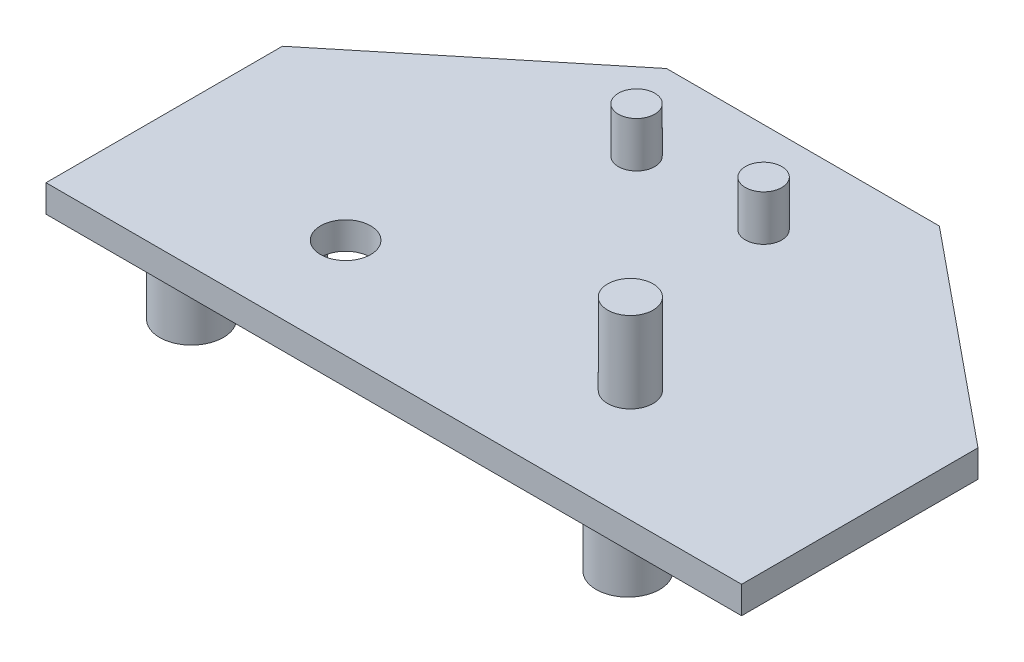
ISO-10303-21;
HEADER;
FILE_DESCRIPTION(('STEP AP214'),'2;1');
FILE_NAME('part.step','',(''),(''),'','','');
FILE_SCHEMA(('AUTOMOTIVE_DESIGN { 1 0 10303 214 1 1 1 1 }'));
ENDSEC;
DATA;
#1=APPLICATION_CONTEXT('core data for automotive mechanical design processes');
#2=APPLICATION_PROTOCOL_DEFINITION('international standard','automotive_design',2000,#1);
#3=PRODUCT_CONTEXT('',#1,'mechanical');
#4=PRODUCT('Part','Part','',(#3));
#5=PRODUCT_RELATED_PRODUCT_CATEGORY('part','',(#4));
#6=PRODUCT_DEFINITION_FORMATION('','',#4);
#7=PRODUCT_DEFINITION_CONTEXT('part definition',#1,'design');
#8=PRODUCT_DEFINITION('design','',#6,#7);
#9=PRODUCT_DEFINITION_SHAPE('','',#8);
#10=(LENGTH_UNIT() NAMED_UNIT(*) SI_UNIT(.MILLI.,.METRE.));
#11=(NAMED_UNIT(*) PLANE_ANGLE_UNIT() SI_UNIT($,.RADIAN.));
#12=(NAMED_UNIT(*) SI_UNIT($,.STERADIAN.) SOLID_ANGLE_UNIT());
#13=UNCERTAINTY_MEASURE_WITH_UNIT(LENGTH_MEASURE(1.E-05),#10,'distance_accuracy_value','');
#14=(GEOMETRIC_REPRESENTATION_CONTEXT(3) GLOBAL_UNCERTAINTY_ASSIGNED_CONTEXT((#13)) GLOBAL_UNIT_ASSIGNED_CONTEXT((#10,
#11,#12)) REPRESENTATION_CONTEXT('',''));
#15=CARTESIAN_POINT('',(0.,0.,0.));
#16=DIRECTION('',(0.,0.,1.));
#17=DIRECTION('',(1.,0.,0.));
#18=AXIS2_PLACEMENT_3D('',#15,#16,#17);
#19=CARTESIAN_POINT('',(0.,0.,0.));
#20=DIRECTION('',(0.,1.,0.));
#21=DIRECTION('',(0.,0.,1.));
#22=AXIS2_PLACEMENT_3D('',#19,#20,#21);
#23=PLANE('',#22);
#24=CARTESIAN_POINT('',(0.,0.,0.));
#25=DIRECTION('',(0.,1.,0.));
#26=DIRECTION('',(0.,0.,1.));
#27=AXIS2_PLACEMENT_3D('',#24,#25,#26);
#28=CIRCLE('',#27,3.5);
#29=CARTESIAN_POINT('',(0.,0.,3.5));
#30=VERTEX_POINT('',#29);
#31=EDGE_CURVE('E146',#30,#30,#28,.T.);
#32=ORIENTED_EDGE('',*,*,#31,.F.);
#33=EDGE_LOOP('',(#32));
#34=FACE_BOUND('',#33,.T.);
#35=CARTESIAN_POINT('',(0.,0.,0.));
#36=DIRECTION('',(0.,1.,0.));
#37=DIRECTION('',(0.,0.,1.));
#38=AXIS2_PLACEMENT_3D('',#35,#36,#37);
#39=CIRCLE('',#38,1.5);
#40=CARTESIAN_POINT('',(0.,0.,1.5));
#41=VERTEX_POINT('',#40);
#42=EDGE_CURVE('E143',#41,#41,#39,.T.);
#43=ORIENTED_EDGE('',*,*,#42,.T.);
#44=EDGE_LOOP('',(#43));
#45=FACE_BOUND('',#44,.T.);
#46=ADVANCED_FACE('F34',(#34,#45),#23,.F.);
#47=CARTESIAN_POINT('',(0.,10.,0.));
#48=DIRECTION('',(0.,-1.,0.));
#49=DIRECTION('',(0.,0.,-1.));
#50=AXIS2_PLACEMENT_3D('',#47,#48,#49);
#51=CYLINDRICAL_SURFACE('',#50,3.5);
#52=CARTESIAN_POINT('',(0.,10.,0.));
#53=DIRECTION('',(0.,1.,0.));
#54=DIRECTION('',(0.,0.,1.));
#55=AXIS2_PLACEMENT_3D('',#52,#53,#54);
#56=CIRCLE('',#55,3.5);
#57=CARTESIAN_POINT('',(0.,10.,3.5));
#58=VERTEX_POINT('',#57);
#59=EDGE_CURVE('E147',#58,#58,#56,.T.);
#60=ORIENTED_EDGE('',*,*,#59,.F.);
#61=EDGE_LOOP('',(#60));
#62=FACE_BOUND('',#61,.T.);
#63=ORIENTED_EDGE('',*,*,#31,.T.);
#64=EDGE_LOOP('',(#63));
#65=FACE_BOUND('',#64,.T.);
#66=ADVANCED_FACE('F36',(#62,#65),#51,.T.);
#67=CARTESIAN_POINT('',(0.,10.,0.));
#68=DIRECTION('',(0.,-1.,0.));
#69=DIRECTION('',(0.,0.,-1.));
#70=AXIS2_PLACEMENT_3D('',#67,#68,#69);
#71=CYLINDRICAL_SURFACE('',#70,1.5);
#72=CARTESIAN_POINT('',(0.,10.,0.));
#73=DIRECTION('',(0.,-1.,0.));
#74=DIRECTION('',(0.,0.,-1.));
#75=AXIS2_PLACEMENT_3D('',#72,#73,#74);
#76=CIRCLE('',#75,1.5);
#77=CARTESIAN_POINT('',(0.,10.,-1.5));
#78=VERTEX_POINT('',#77);
#79=EDGE_CURVE('E140',#78,#78,#76,.T.);
#80=ORIENTED_EDGE('',*,*,#79,.F.);
#81=EDGE_LOOP('',(#80));
#82=FACE_BOUND('',#81,.T.);
#83=ORIENTED_EDGE('',*,*,#42,.F.);
#84=EDGE_LOOP('',(#83));
#85=FACE_BOUND('',#84,.T.);
#86=ADVANCED_FACE('F236',(#82,#85),#71,.F.);
#87=CARTESIAN_POINT('',(0.,10.,0.));
#88=DIRECTION('',(0.,-1.,0.));
#89=DIRECTION('',(0.,0.,-1.));
#90=AXIS2_PLACEMENT_3D('',#87,#88,#89);
#91=PLANE('',#90);
#92=ORIENTED_EDGE('',*,*,#79,.T.);
#93=EDGE_LOOP('',(#92));
#94=FACE_BOUND('',#93,.T.);
#95=ADVANCED_FACE('F243',(#94),#91,.T.);
#96=CARTESIAN_POINT('',(68.5,13.,18.));
#97=DIRECTION('',(0.,0.,-1.));
#98=DIRECTION('',(-1.,0.,0.));
#99=AXIS2_PLACEMENT_3D('',#96,#97,#98);
#100=PLANE('',#99);
#101=DIRECTION('',(1.,0.,0.));
#102=VECTOR('',#101,1.);
#103=CARTESIAN_POINT('',(68.5,10.,18.));
#104=LINE('',#103,#102);
#105=CARTESIAN_POINT('',(-8.,10.,18.));
#106=VERTEX_POINT('',#105);
#107=CARTESIAN_POINT('',(68.5,10.,18.));
#108=VERTEX_POINT('',#107);
#109=EDGE_CURVE('E120',#106,#108,#104,.T.);
#110=ORIENTED_EDGE('',*,*,#109,.T.);
#111=DIRECTION('',(0.,-1.,0.));
#112=VECTOR('',#111,1.);
#113=CARTESIAN_POINT('',(68.5,13.,18.));
#114=LINE('',#113,#112);
#115=CARTESIAN_POINT('',(68.5,13.,18.));
#116=VERTEX_POINT('',#115);
#117=EDGE_CURVE('E138',#116,#108,#114,.T.);
#118=ORIENTED_EDGE('',*,*,#117,.F.);
#119=DIRECTION('',(1.,0.,0.));
#120=VECTOR('',#119,1.);
#121=CARTESIAN_POINT('',(68.5,13.,18.));
#122=LINE('',#121,#120);
#123=CARTESIAN_POINT('',(-8.,13.,18.));
#124=VERTEX_POINT('',#123);
#125=EDGE_CURVE('E131',#124,#116,#122,.T.);
#126=ORIENTED_EDGE('',*,*,#125,.F.);
#127=DIRECTION('',(0.,-1.,0.));
#128=VECTOR('',#127,1.);
#129=CARTESIAN_POINT('',(-8.,13.,18.));
#130=LINE('',#129,#128);
#131=EDGE_CURVE('E116',#124,#106,#130,.T.);
#132=ORIENTED_EDGE('',*,*,#131,.T.);
#133=EDGE_LOOP('',(#110,#118,#126,#132));
#134=FACE_BOUND('',#133,.T.);
#135=ADVANCED_FACE('F223',(#134),#100,.F.);
#136=CARTESIAN_POINT('',(68.5,13.,-8.));
#137=DIRECTION('',(-1.,0.,0.));
#138=DIRECTION('',(0.,0.,1.));
#139=AXIS2_PLACEMENT_3D('',#136,#137,#138);
#140=PLANE('',#139);
#141=DIRECTION('',(0.,0.,-1.));
#142=VECTOR('',#141,1.);
#143=CARTESIAN_POINT('',(68.5,10.,-8.));
#144=LINE('',#143,#142);
#145=CARTESIAN_POINT('',(68.5,10.,-8.));
#146=VERTEX_POINT('',#145);
#147=EDGE_CURVE('E123',#108,#146,#144,.T.);
#148=ORIENTED_EDGE('',*,*,#147,.T.);
#149=DIRECTION('',(0.,-1.,0.));
#150=VECTOR('',#149,1.);
#151=CARTESIAN_POINT('',(68.5,13.,-8.));
#152=LINE('',#151,#150);
#153=CARTESIAN_POINT('',(68.5,13.,-8.));
#154=VERTEX_POINT('',#153);
#155=EDGE_CURVE('E135',#154,#146,#152,.T.);
#156=ORIENTED_EDGE('',*,*,#155,.F.);
#157=DIRECTION('',(0.,0.,-1.));
#158=VECTOR('',#157,1.);
#159=CARTESIAN_POINT('',(68.5,13.,-8.));
#160=LINE('',#159,#158);
#161=EDGE_CURVE('E89',#116,#154,#160,.T.);
#162=ORIENTED_EDGE('',*,*,#161,.F.);
#163=ORIENTED_EDGE('',*,*,#117,.T.);
#164=EDGE_LOOP('',(#148,#156,#162,#163));
#165=FACE_BOUND('',#164,.T.);
#166=ADVANCED_FACE('F216',(#165),#140,.F.);
#167=CARTESIAN_POINT('',(45.25,13.,-27.));
#168=DIRECTION('',(-0.632784279625156,0.,0.774328131646573));
#169=DIRECTION('',(0.774328131646573,0.,0.632784279625156));
#170=AXIS2_PLACEMENT_3D('',#167,#168,#169);
#171=PLANE('',#170);
#172=DIRECTION('',(-0.774328131646573,0.,-0.632784279625156));
#173=VECTOR('',#172,1.);
#174=CARTESIAN_POINT('',(45.25,10.,-27.));
#175=LINE('',#174,#173);
#176=CARTESIAN_POINT('',(45.25,10.,-27.));
#177=VERTEX_POINT('',#176);
#178=EDGE_CURVE('E126',#146,#177,#175,.T.);
#179=ORIENTED_EDGE('',*,*,#178,.T.);
#180=DIRECTION('',(0.,-1.,0.));
#181=VECTOR('',#180,1.);
#182=CARTESIAN_POINT('',(45.25,13.,-27.));
#183=LINE('',#182,#181);
#184=CARTESIAN_POINT('',(45.25,13.,-27.));
#185=VERTEX_POINT('',#184);
#186=EDGE_CURVE('E111',#185,#177,#183,.T.);
#187=ORIENTED_EDGE('',*,*,#186,.F.);
#188=DIRECTION('',(-0.774328131646573,0.,-0.632784279625156));
#189=VECTOR('',#188,1.);
#190=CARTESIAN_POINT('',(45.25,13.,-27.));
#191=LINE('',#190,#189);
#192=EDGE_CURVE('E102',#154,#185,#191,.T.);
#193=ORIENTED_EDGE('',*,*,#192,.F.);
#194=ORIENTED_EDGE('',*,*,#155,.T.);
#195=EDGE_LOOP('',(#179,#187,#193,#194));
#196=FACE_BOUND('',#195,.T.);
#197=ADVANCED_FACE('F219',(#196),#171,.F.);
#198=CARTESIAN_POINT('',(15.25,13.,-27.));
#199=DIRECTION('',(0.,0.,1.));
#200=DIRECTION('',(1.,0.,0.));
#201=AXIS2_PLACEMENT_3D('',#198,#199,#200);
#202=PLANE('',#201);
#203=DIRECTION('',(-1.,0.,0.));
#204=VECTOR('',#203,1.);
#205=CARTESIAN_POINT('',(15.25,10.,-27.));
#206=LINE('',#205,#204);
#207=CARTESIAN_POINT('',(15.25,10.,-27.));
#208=VERTEX_POINT('',#207);
#209=EDGE_CURVE('E110',#177,#208,#206,.T.);
#210=ORIENTED_EDGE('',*,*,#209,.T.);
#211=DIRECTION('',(0.,-1.,0.));
#212=VECTOR('',#211,1.);
#213=CARTESIAN_POINT('',(15.25,13.,-27.));
#214=LINE('',#213,#212);
#215=CARTESIAN_POINT('',(15.25,13.,-27.));
#216=VERTEX_POINT('',#215);
#217=EDGE_CURVE('E107',#216,#208,#214,.T.);
#218=ORIENTED_EDGE('',*,*,#217,.F.);
#219=DIRECTION('',(-1.,0.,0.));
#220=VECTOR('',#219,1.);
#221=CARTESIAN_POINT('',(15.25,13.,-27.));
#222=LINE('',#221,#220);
#223=EDGE_CURVE('E96',#185,#216,#222,.T.);
#224=ORIENTED_EDGE('',*,*,#223,.F.);
#225=ORIENTED_EDGE('',*,*,#186,.T.);
#226=EDGE_LOOP('',(#210,#218,#224,#225));
#227=FACE_BOUND('',#226,.T.);
#228=ADVANCED_FACE('F108',(#227),#202,.F.);
#229=CARTESIAN_POINT('',(-8.,13.,-8.));
#230=DIRECTION('',(0.632784279625156,0.,0.774328131646573));
#231=DIRECTION('',(0.774328131646573,0.,-0.632784279625156));
#232=AXIS2_PLACEMENT_3D('',#229,#230,#231);
#233=PLANE('',#232);
#234=DIRECTION('',(-0.774328131646573,0.,0.632784279625156));
#235=VECTOR('',#234,1.);
#236=CARTESIAN_POINT('',(-8.,10.,-8.));
#237=LINE('',#236,#235);
#238=CARTESIAN_POINT('',(-8.,10.,-8.));
#239=VERTEX_POINT('',#238);
#240=EDGE_CURVE('E74',#208,#239,#237,.T.);
#241=ORIENTED_EDGE('',*,*,#240,.T.);
#242=DIRECTION('',(0.,-1.,0.));
#243=VECTOR('',#242,1.);
#244=CARTESIAN_POINT('',(-8.,13.,-8.));
#245=LINE('',#244,#243);
#246=CARTESIAN_POINT('',(-8.,13.,-8.));
#247=VERTEX_POINT('',#246);
#248=EDGE_CURVE('E112',#247,#239,#245,.T.);
#249=ORIENTED_EDGE('',*,*,#248,.F.);
#250=DIRECTION('',(-0.774328131646573,0.,0.632784279625156));
#251=VECTOR('',#250,1.);
#252=CARTESIAN_POINT('',(-8.,13.,-8.));
#253=LINE('',#252,#251);
#254=EDGE_CURVE('E100',#216,#247,#253,.T.);
#255=ORIENTED_EDGE('',*,*,#254,.F.);
#256=ORIENTED_EDGE('',*,*,#217,.T.);
#257=EDGE_LOOP('',(#241,#249,#255,#256));
#258=FACE_BOUND('',#257,.T.);
#259=ADVANCED_FACE('F114',(#258),#233,.F.);
#260=CARTESIAN_POINT('',(-8.,13.,18.));
#261=DIRECTION('',(1.,0.,0.));
#262=DIRECTION('',(0.,0.,-1.));
#263=AXIS2_PLACEMENT_3D('',#260,#261,#262);
#264=PLANE('',#263);
#265=DIRECTION('',(0.,0.,1.));
#266=VECTOR('',#265,1.);
#267=CARTESIAN_POINT('',(-8.,10.,18.));
#268=LINE('',#267,#266);
#269=EDGE_CURVE('E80',#239,#106,#268,.T.);
#270=ORIENTED_EDGE('',*,*,#269,.T.);
#271=ORIENTED_EDGE('',*,*,#131,.F.);
#272=DIRECTION('',(0.,0.,1.));
#273=VECTOR('',#272,1.);
#274=CARTESIAN_POINT('',(-8.,13.,18.));
#275=LINE('',#274,#273);
#276=EDGE_CURVE('E51',#247,#124,#275,.T.);
#277=ORIENTED_EDGE('',*,*,#276,.F.);
#278=ORIENTED_EDGE('',*,*,#248,.T.);
#279=EDGE_LOOP('',(#270,#271,#277,#278));
#280=FACE_BOUND('',#279,.T.);
#281=ADVANCED_FACE('F171',(#280),#264,.F.);
#282=CARTESIAN_POINT('',(0.,13.,0.));
#283=DIRECTION('',(0.,-1.,0.));
#284=DIRECTION('',(0.,0.,-1.));
#285=AXIS2_PLACEMENT_3D('',#282,#283,#284);
#286=PLANE('',#285);
#287=CARTESIAN_POINT('',(35.919609607067,13.,-17.));
#288=DIRECTION('',(0.,-1.,0.));
#289=DIRECTION('',(0.,0.,-1.));
#290=AXIS2_PLACEMENT_3D('',#287,#288,#289);
#291=CIRCLE('',#290,2.);
#292=CARTESIAN_POINT('',(35.919609607067,13.,-19.));
#293=VERTEX_POINT('',#292);
#294=EDGE_CURVE('E11',#293,#293,#291,.F.);
#295=ORIENTED_EDGE('',*,*,#294,.F.);
#296=EDGE_LOOP('',(#295));
#297=FACE_BOUND('',#296,.T.);
#298=CARTESIAN_POINT('',(21.95,13.,-17.));
#299=DIRECTION('',(0.,-1.,0.));
#300=DIRECTION('',(0.,0.,-1.));
#301=AXIS2_PLACEMENT_3D('',#298,#299,#300);
#302=CIRCLE('',#301,2.);
#303=CARTESIAN_POINT('',(21.95,13.,-19.));
#304=VERTEX_POINT('',#303);
#305=EDGE_CURVE('E43',#304,#304,#302,.F.);
#306=ORIENTED_EDGE('',*,*,#305,.F.);
#307=EDGE_LOOP('',(#306));
#308=FACE_BOUND('',#307,.T.);
#309=CARTESIAN_POINT('',(43.919609607067,13.,5.65));
#310=DIRECTION('',(0.,-1.,0.));
#311=DIRECTION('',(0.,0.,-1.));
#312=AXIS2_PLACEMENT_3D('',#309,#310,#311);
#313=CIRCLE('',#312,2.5);
#314=CARTESIAN_POINT('',(43.919609607067,13.,3.15));
#315=VERTEX_POINT('',#314);
#316=EDGE_CURVE('E161',#315,#315,#313,.F.);
#317=ORIENTED_EDGE('',*,*,#316,.F.);
#318=EDGE_LOOP('',(#317));
#319=FACE_BOUND('',#318,.T.);
#320=CARTESIAN_POINT('',(13.95,13.,7.));
#321=DIRECTION('',(0.,-1.,0.));
#322=DIRECTION('',(0.,0.,-1.));
#323=AXIS2_PLACEMENT_3D('',#320,#321,#322);
#324=CIRCLE('',#323,2.75);
#325=CARTESIAN_POINT('',(13.95,13.,4.25));
#326=VERTEX_POINT('',#325);
#327=EDGE_CURVE('E178',#326,#326,#324,.T.);
#328=ORIENTED_EDGE('',*,*,#327,.T.);
#329=EDGE_LOOP('',(#328));
#330=FACE_BOUND('',#329,.T.);
#331=ORIENTED_EDGE('',*,*,#125,.T.);
#332=ORIENTED_EDGE('',*,*,#161,.T.);
#333=ORIENTED_EDGE('',*,*,#192,.T.);
#334=ORIENTED_EDGE('',*,*,#223,.T.);
#335=ORIENTED_EDGE('',*,*,#254,.T.);
#336=ORIENTED_EDGE('',*,*,#276,.T.);
#337=EDGE_LOOP('',(#331,#332,#333,#334,#335,#336));
#338=FACE_BOUND('',#337,.T.);
#339=ADVANCED_FACE('F98',(#297,#308,#319,#330,#338),#286,.F.);
#340=CARTESIAN_POINT('',(13.95,10.,7.));
#341=DIRECTION('',(0.,-1.,0.));
#342=DIRECTION('',(0.,0.,-1.));
#343=AXIS2_PLACEMENT_3D('',#340,#341,#342);
#344=CIRCLE('',#343,2.75);
#345=CARTESIAN_POINT('',(13.95,10.,4.25));
#346=VERTEX_POINT('',#345);
#347=EDGE_CURVE('E181',#346,#346,#344,.T.);
#348=ORIENTED_EDGE('',*,*,#347,.F.);
#349=EDGE_LOOP('',(#348));
#350=FACE_BOUND('',#349,.T.);
#351=CARTESIAN_POINT('',(48.,10.,0.));
#352=DIRECTION('',(0.,1.,0.));
#353=DIRECTION('',(0.,0.,1.));
#354=AXIS2_PLACEMENT_3D('',#351,#352,#353);
#355=CIRCLE('',#354,3.5);
#356=CARTESIAN_POINT('',(48.,10.,3.5));
#357=VERTEX_POINT('',#356);
#358=EDGE_CURVE('E191',#357,#357,#355,.T.);
#359=ORIENTED_EDGE('',*,*,#358,.T.);
#360=EDGE_LOOP('',(#359));
#361=FACE_BOUND('',#360,.T.);
#362=CARTESIAN_POINT('',(48.,10.,10.));
#363=DIRECTION('',(0.,1.,0.));
#364=DIRECTION('',(0.,0.,1.));
#365=AXIS2_PLACEMENT_3D('',#362,#363,#364);
#366=CIRCLE('',#365,3.5);
#367=CARTESIAN_POINT('',(48.,10.,13.5));
#368=VERTEX_POINT('',#367);
#369=EDGE_CURVE('E200',#368,#368,#366,.T.);
#370=ORIENTED_EDGE('',*,*,#369,.T.);
#371=EDGE_LOOP('',(#370));
#372=FACE_BOUND('',#371,.T.);
#373=CARTESIAN_POINT('',(0.,10.,10.));
#374=DIRECTION('',(0.,1.,0.));
#375=DIRECTION('',(0.,0.,1.));
#376=AXIS2_PLACEMENT_3D('',#373,#374,#375);
#377=CIRCLE('',#376,3.5);
#378=CARTESIAN_POINT('',(0.,10.,13.5));
#379=VERTEX_POINT('',#378);
#380=EDGE_CURVE('E124',#379,#379,#377,.T.);
#381=ORIENTED_EDGE('',*,*,#380,.T.);
#382=EDGE_LOOP('',(#381));
#383=FACE_BOUND('',#382,.T.);
#384=ORIENTED_EDGE('',*,*,#59,.T.);
#385=EDGE_LOOP('',(#384));
#386=FACE_BOUND('',#385,.T.);
#387=ORIENTED_EDGE('',*,*,#109,.F.);
#388=ORIENTED_EDGE('',*,*,#269,.F.);
#389=ORIENTED_EDGE('',*,*,#240,.F.);
#390=ORIENTED_EDGE('',*,*,#209,.F.);
#391=ORIENTED_EDGE('',*,*,#178,.F.);
#392=ORIENTED_EDGE('',*,*,#147,.F.);
#393=EDGE_LOOP('',(#387,#388,#389,#390,#391,#392));
#394=FACE_BOUND('',#393,.T.);
#395=ADVANCED_FACE('F170',(#350,#361,#372,#383,#386,#394),#91,.T.);
#396=CARTESIAN_POINT('',(0.,0.,10.));
#397=DIRECTION('',(0.,1.,0.));
#398=DIRECTION('',(0.,0.,1.));
#399=AXIS2_PLACEMENT_3D('',#396,#397,#398);
#400=PLANE('',#399);
#401=CARTESIAN_POINT('',(0.,0.,10.));
#402=DIRECTION('',(0.,1.,0.));
#403=DIRECTION('',(0.,0.,1.));
#404=AXIS2_PLACEMENT_3D('',#401,#402,#403);
#405=CIRCLE('',#404,3.5);
#406=CARTESIAN_POINT('',(0.,0.,13.5));
#407=VERTEX_POINT('',#406);
#408=EDGE_CURVE('E208',#407,#407,#405,.T.);
#409=ORIENTED_EDGE('',*,*,#408,.F.);
#410=EDGE_LOOP('',(#409));
#411=FACE_BOUND('',#410,.T.);
#412=CARTESIAN_POINT('',(0.,0.,10.));
#413=DIRECTION('',(0.,1.,0.));
#414=DIRECTION('',(0.,0.,1.));
#415=AXIS2_PLACEMENT_3D('',#412,#413,#414);
#416=CIRCLE('',#415,1.5);
#417=CARTESIAN_POINT('',(0.,0.,11.5));
#418=VERTEX_POINT('',#417);
#419=EDGE_CURVE('E203',#418,#418,#416,.T.);
#420=ORIENTED_EDGE('',*,*,#419,.T.);
#421=EDGE_LOOP('',(#420));
#422=FACE_BOUND('',#421,.T.);
#423=ADVANCED_FACE('F270',(#411,#422),#400,.F.);
#424=CARTESIAN_POINT('',(0.,10.,10.));
#425=DIRECTION('',(0.,-1.,0.));
#426=DIRECTION('',(0.,0.,-1.));
#427=AXIS2_PLACEMENT_3D('',#424,#425,#426);
#428=CYLINDRICAL_SURFACE('',#427,3.5);
#429=ORIENTED_EDGE('',*,*,#380,.F.);
#430=EDGE_LOOP('',(#429));
#431=FACE_BOUND('',#430,.T.);
#432=ORIENTED_EDGE('',*,*,#408,.T.);
#433=EDGE_LOOP('',(#432));
#434=FACE_BOUND('',#433,.T.);
#435=ADVANCED_FACE('F275',(#431,#434),#428,.T.);
#436=CARTESIAN_POINT('',(0.,10.,10.));
#437=DIRECTION('',(0.,-1.,0.));
#438=DIRECTION('',(0.,0.,-1.));
#439=AXIS2_PLACEMENT_3D('',#436,#437,#438);
#440=CYLINDRICAL_SURFACE('',#439,1.5);
#441=CARTESIAN_POINT('',(0.,10.,10.));
#442=DIRECTION('',(0.,-1.,0.));
#443=DIRECTION('',(0.,0.,-1.));
#444=AXIS2_PLACEMENT_3D('',#441,#442,#443);
#445=CIRCLE('',#444,1.5);
#446=CARTESIAN_POINT('',(0.,10.,8.5));
#447=VERTEX_POINT('',#446);
#448=EDGE_CURVE('E150',#447,#447,#445,.F.);
#449=ORIENTED_EDGE('',*,*,#448,.T.);
#450=EDGE_LOOP('',(#449));
#451=FACE_BOUND('',#450,.T.);
#452=ORIENTED_EDGE('',*,*,#419,.F.);
#453=EDGE_LOOP('',(#452));
#454=FACE_BOUND('',#453,.T.);
#455=ADVANCED_FACE('F287',(#451,#454),#440,.F.);
#456=ORIENTED_EDGE('',*,*,#448,.F.);
#457=EDGE_LOOP('',(#456));
#458=FACE_BOUND('',#457,.T.);
#459=ADVANCED_FACE('F297',(#458),#91,.T.);
#460=CARTESIAN_POINT('',(48.,0.,10.));
#461=DIRECTION('',(0.,1.,0.));
#462=DIRECTION('',(0.,0.,1.));
#463=AXIS2_PLACEMENT_3D('',#460,#461,#462);
#464=PLANE('',#463);
#465=CARTESIAN_POINT('',(48.,0.,10.));
#466=DIRECTION('',(0.,1.,0.));
#467=DIRECTION('',(0.,0.,1.));
#468=AXIS2_PLACEMENT_3D('',#465,#466,#467);
#469=CIRCLE('',#468,3.5);
#470=CARTESIAN_POINT('',(48.,0.,13.5));
#471=VERTEX_POINT('',#470);
#472=EDGE_CURVE('E199',#471,#471,#469,.T.);
#473=ORIENTED_EDGE('',*,*,#472,.F.);
#474=EDGE_LOOP('',(#473));
#475=FACE_BOUND('',#474,.T.);
#476=CARTESIAN_POINT('',(48.,0.,10.));
#477=DIRECTION('',(0.,1.,0.));
#478=DIRECTION('',(0.,0.,1.));
#479=AXIS2_PLACEMENT_3D('',#476,#477,#478);
#480=CIRCLE('',#479,1.5);
#481=CARTESIAN_POINT('',(48.,0.,11.5));
#482=VERTEX_POINT('',#481);
#483=EDGE_CURVE('E194',#482,#482,#480,.T.);
#484=ORIENTED_EDGE('',*,*,#483,.T.);
#485=EDGE_LOOP('',(#484));
#486=FACE_BOUND('',#485,.T.);
#487=ADVANCED_FACE('F308',(#475,#486),#464,.F.);
#488=CARTESIAN_POINT('',(48.,10.,10.));
#489=DIRECTION('',(0.,-1.,0.));
#490=DIRECTION('',(0.,0.,-1.));
#491=AXIS2_PLACEMENT_3D('',#488,#489,#490);
#492=CYLINDRICAL_SURFACE('',#491,3.5);
#493=ORIENTED_EDGE('',*,*,#369,.F.);
#494=EDGE_LOOP('',(#493));
#495=FACE_BOUND('',#494,.T.);
#496=ORIENTED_EDGE('',*,*,#472,.T.);
#497=EDGE_LOOP('',(#496));
#498=FACE_BOUND('',#497,.T.);
#499=ADVANCED_FACE('F319',(#495,#498),#492,.T.);
#500=CARTESIAN_POINT('',(48.,10.,10.));
#501=DIRECTION('',(0.,-1.,0.));
#502=DIRECTION('',(0.,0.,-1.));
#503=AXIS2_PLACEMENT_3D('',#500,#501,#502);
#504=CYLINDRICAL_SURFACE('',#503,1.5);
#505=CARTESIAN_POINT('',(48.,10.,10.));
#506=DIRECTION('',(0.,-1.,0.));
#507=DIRECTION('',(0.,0.,-1.));
#508=AXIS2_PLACEMENT_3D('',#505,#506,#507);
#509=CIRCLE('',#508,1.5);
#510=CARTESIAN_POINT('',(48.,10.,8.49999999999999));
#511=VERTEX_POINT('',#510);
#512=EDGE_CURVE('E155',#511,#511,#509,.F.);
#513=ORIENTED_EDGE('',*,*,#512,.T.);
#514=EDGE_LOOP('',(#513));
#515=FACE_BOUND('',#514,.T.);
#516=ORIENTED_EDGE('',*,*,#483,.F.);
#517=EDGE_LOOP('',(#516));
#518=FACE_BOUND('',#517,.T.);
#519=ADVANCED_FACE('F329',(#515,#518),#504,.F.);
#520=ORIENTED_EDGE('',*,*,#512,.F.);
#521=EDGE_LOOP('',(#520));
#522=FACE_BOUND('',#521,.T.);
#523=ADVANCED_FACE('F310',(#522),#91,.T.);
#524=CARTESIAN_POINT('',(48.,0.,0.));
#525=DIRECTION('',(0.,1.,0.));
#526=DIRECTION('',(0.,0.,1.));
#527=AXIS2_PLACEMENT_3D('',#524,#525,#526);
#528=PLANE('',#527);
#529=CARTESIAN_POINT('',(48.,0.,0.));
#530=DIRECTION('',(0.,1.,0.));
#531=DIRECTION('',(0.,0.,1.));
#532=AXIS2_PLACEMENT_3D('',#529,#530,#531);
#533=CIRCLE('',#532,3.5);
#534=CARTESIAN_POINT('',(48.,0.,3.5));
#535=VERTEX_POINT('',#534);
#536=EDGE_CURVE('E184',#535,#535,#533,.T.);
#537=ORIENTED_EDGE('',*,*,#536,.F.);
#538=EDGE_LOOP('',(#537));
#539=FACE_BOUND('',#538,.T.);
#540=CARTESIAN_POINT('',(48.,0.,0.));
#541=DIRECTION('',(0.,1.,0.));
#542=DIRECTION('',(0.,0.,1.));
#543=AXIS2_PLACEMENT_3D('',#540,#541,#542);
#544=CIRCLE('',#543,1.5);
#545=CARTESIAN_POINT('',(48.,0.,1.5));
#546=VERTEX_POINT('',#545);
#547=EDGE_CURVE('E180',#546,#546,#544,.T.);
#548=ORIENTED_EDGE('',*,*,#547,.T.);
#549=EDGE_LOOP('',(#548));
#550=FACE_BOUND('',#549,.T.);
#551=ADVANCED_FACE('F348',(#539,#550),#528,.F.);
#552=CARTESIAN_POINT('',(48.,10.,0.));
#553=DIRECTION('',(0.,-1.,0.));
#554=DIRECTION('',(0.,0.,-1.));
#555=AXIS2_PLACEMENT_3D('',#552,#553,#554);
#556=CYLINDRICAL_SURFACE('',#555,3.5);
#557=ORIENTED_EDGE('',*,*,#358,.F.);
#558=EDGE_LOOP('',(#557));
#559=FACE_BOUND('',#558,.T.);
#560=ORIENTED_EDGE('',*,*,#536,.T.);
#561=EDGE_LOOP('',(#560));
#562=FACE_BOUND('',#561,.T.);
#563=ADVANCED_FACE('F358',(#559,#562),#556,.T.);
#564=CARTESIAN_POINT('',(48.,10.,0.));
#565=DIRECTION('',(0.,-1.,0.));
#566=DIRECTION('',(0.,0.,-1.));
#567=AXIS2_PLACEMENT_3D('',#564,#565,#566);
#568=CYLINDRICAL_SURFACE('',#567,1.5);
#569=CARTESIAN_POINT('',(48.,10.,0.));
#570=DIRECTION('',(0.,-1.,0.));
#571=DIRECTION('',(0.,0.,-1.));
#572=AXIS2_PLACEMENT_3D('',#569,#570,#571);
#573=CIRCLE('',#572,1.5);
#574=CARTESIAN_POINT('',(48.,10.,-1.5));
#575=VERTEX_POINT('',#574);
#576=EDGE_CURVE('E158',#575,#575,#573,.F.);
#577=ORIENTED_EDGE('',*,*,#576,.T.);
#578=EDGE_LOOP('',(#577));
#579=FACE_BOUND('',#578,.T.);
#580=ORIENTED_EDGE('',*,*,#547,.F.);
#581=EDGE_LOOP('',(#580));
#582=FACE_BOUND('',#581,.T.);
#583=ADVANCED_FACE('F368',(#579,#582),#568,.F.);
#584=ORIENTED_EDGE('',*,*,#576,.F.);
#585=EDGE_LOOP('',(#584));
#586=FACE_BOUND('',#585,.T.);
#587=ADVANCED_FACE('F350',(#586),#91,.T.);
#588=CARTESIAN_POINT('',(13.95,14.,7.));
#589=DIRECTION('',(0.,-1.,0.));
#590=DIRECTION('',(0.,0.,-1.));
#591=AXIS2_PLACEMENT_3D('',#588,#589,#590);
#592=CYLINDRICAL_SURFACE('',#591,2.75);
#593=ORIENTED_EDGE('',*,*,#347,.T.);
#594=EDGE_LOOP('',(#593));
#595=FACE_BOUND('',#594,.T.);
#596=ORIENTED_EDGE('',*,*,#327,.F.);
#597=EDGE_LOOP('',(#596));
#598=FACE_BOUND('',#597,.T.);
#599=ADVANCED_FACE('F387',(#595,#598),#592,.F.);
#600=CARTESIAN_POINT('',(43.919609607067,21.9,5.65));
#601=DIRECTION('',(0.,-1.,0.));
#602=DIRECTION('',(0.,0.,-1.));
#603=AXIS2_PLACEMENT_3D('',#600,#601,#602);
#604=CYLINDRICAL_SURFACE('',#603,2.5);
#605=CARTESIAN_POINT('',(43.919609607067,21.9,5.65));
#606=DIRECTION('',(0.,1.,0.));
#607=DIRECTION('',(0.,0.,1.));
#608=AXIS2_PLACEMENT_3D('',#605,#606,#607);
#609=CIRCLE('',#608,2.5);
#610=CARTESIAN_POINT('',(43.919609607067,21.9,8.15));
#611=VERTEX_POINT('',#610);
#612=EDGE_CURVE('E187',#611,#611,#609,.T.);
#613=ORIENTED_EDGE('',*,*,#612,.F.);
#614=EDGE_LOOP('',(#613));
#615=FACE_BOUND('',#614,.T.);
#616=ORIENTED_EDGE('',*,*,#316,.T.);
#617=EDGE_LOOP('',(#616));
#618=FACE_BOUND('',#617,.T.);
#619=ADVANCED_FACE('F402',(#615,#618),#604,.T.);
#620=CARTESIAN_POINT('',(43.919609607067,21.9,5.65));
#621=DIRECTION('',(0.,1.,0.));
#622=DIRECTION('',(0.,0.,1.));
#623=AXIS2_PLACEMENT_3D('',#620,#621,#622);
#624=PLANE('',#623);
#625=ORIENTED_EDGE('',*,*,#612,.T.);
#626=EDGE_LOOP('',(#625));
#627=FACE_BOUND('',#626,.T.);
#628=ADVANCED_FACE('F412',(#627),#624,.T.);
#629=CARTESIAN_POINT('',(21.95,18.,-17.));
#630=DIRECTION('',(0.,-1.,0.));
#631=DIRECTION('',(0.,0.,-1.));
#632=AXIS2_PLACEMENT_3D('',#629,#630,#631);
#633=CYLINDRICAL_SURFACE('',#632,2.);
#634=CARTESIAN_POINT('',(21.95,18.,-17.));
#635=DIRECTION('',(0.,1.,0.));
#636=DIRECTION('',(0.,0.,1.));
#637=AXIS2_PLACEMENT_3D('',#634,#635,#636);
#638=CIRCLE('',#637,2.);
#639=CARTESIAN_POINT('',(21.95,18.,-15.));
#640=VERTEX_POINT('',#639);
#641=EDGE_CURVE('E473',#640,#640,#638,.T.);
#642=ORIENTED_EDGE('',*,*,#641,.F.);
#643=EDGE_LOOP('',(#642));
#644=FACE_BOUND('',#643,.T.);
#645=ORIENTED_EDGE('',*,*,#305,.T.);
#646=EDGE_LOOP('',(#645));
#647=FACE_BOUND('',#646,.T.);
#648=ADVANCED_FACE('F166',(#644,#647),#633,.T.);
#649=CARTESIAN_POINT('',(21.95,18.,-17.));
#650=DIRECTION('',(0.,1.,0.));
#651=DIRECTION('',(0.,0.,1.));
#652=AXIS2_PLACEMENT_3D('',#649,#650,#651);
#653=PLANE('',#652);
#654=ORIENTED_EDGE('',*,*,#641,.T.);
#655=EDGE_LOOP('',(#654));
#656=FACE_BOUND('',#655,.T.);
#657=ADVANCED_FACE('F436',(#656),#653,.T.);
#658=CARTESIAN_POINT('',(35.919609607067,18.,-17.));
#659=DIRECTION('',(0.,-1.,0.));
#660=DIRECTION('',(0.,0.,-1.));
#661=AXIS2_PLACEMENT_3D('',#658,#659,#660);
#662=CYLINDRICAL_SURFACE('',#661,2.);
#663=CARTESIAN_POINT('',(35.919609607067,18.,-17.));
#664=DIRECTION('',(0.,1.,0.));
#665=DIRECTION('',(0.,0.,1.));
#666=AXIS2_PLACEMENT_3D('',#663,#664,#665);
#667=CIRCLE('',#666,2.);
#668=CARTESIAN_POINT('',(35.919609607067,18.,-15.));
#669=VERTEX_POINT('',#668);
#670=EDGE_CURVE('E472',#669,#669,#667,.T.);
#671=ORIENTED_EDGE('',*,*,#670,.F.);
#672=EDGE_LOOP('',(#671));
#673=FACE_BOUND('',#672,.T.);
#674=ORIENTED_EDGE('',*,*,#294,.T.);
#675=EDGE_LOOP('',(#674));
#676=FACE_BOUND('',#675,.T.);
#677=ADVANCED_FACE('F446',(#673,#676),#662,.T.);
#678=CARTESIAN_POINT('',(35.919609607067,18.,-17.));
#679=DIRECTION('',(0.,1.,0.));
#680=DIRECTION('',(0.,0.,1.));
#681=AXIS2_PLACEMENT_3D('',#678,#679,#680);
#682=PLANE('',#681);
#683=ORIENTED_EDGE('',*,*,#670,.T.);
#684=EDGE_LOOP('',(#683));
#685=FACE_BOUND('',#684,.T.);
#686=ADVANCED_FACE('F456',(#685),#682,.T.);
#687=CLOSED_SHELL('',(#46,#66,#86,#95,#135,#166,#197,#228,#259,#281,#339,#395,#423,#435,#455,
#459,#487,#499,#519,#523,#551,#563,#583,#587,#599,#619,#628,#648,#657,#677,#686));
#688=MANIFOLD_SOLID_BREP('B2',#687);
#689=ADVANCED_BREP_SHAPE_REPRESENTATION('',(#18,#688),#14);
#690=SHAPE_DEFINITION_REPRESENTATION(#9,#689);
ENDSEC;
END-ISO-10303-21;
